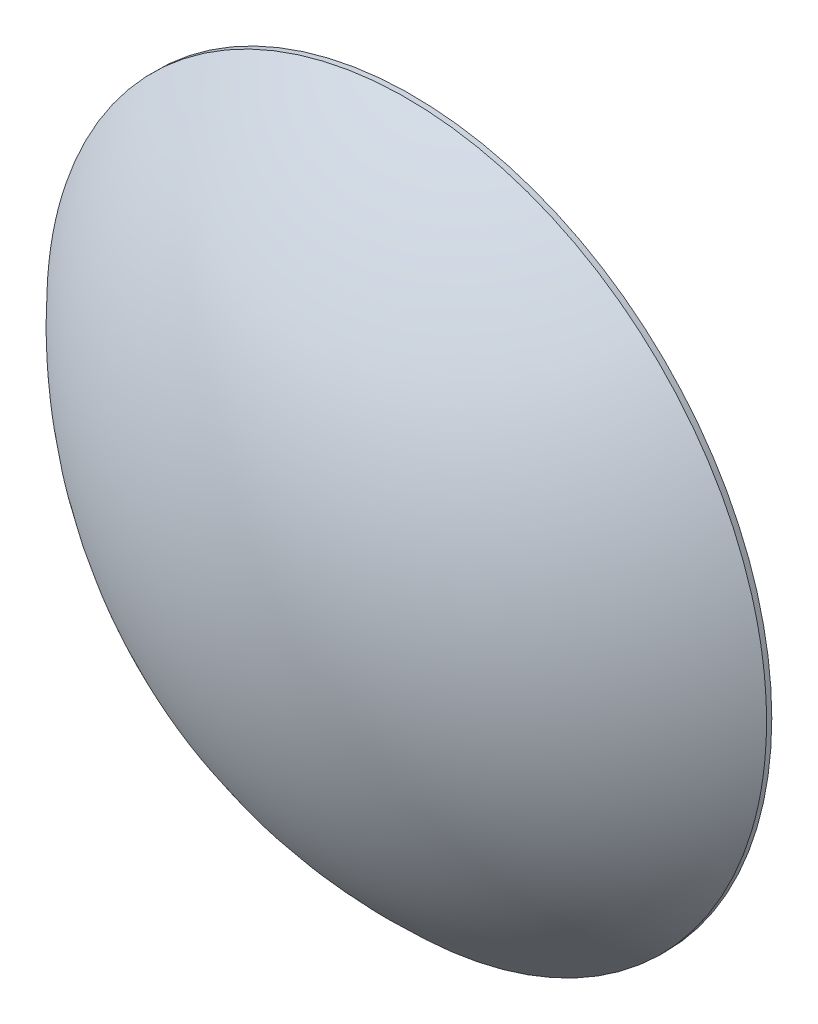
ISO-10303-21;
HEADER;
FILE_DESCRIPTION(('STEP AP214'),'2;1');
FILE_NAME('part.step','',(''),(''),'','','');
FILE_SCHEMA(('AUTOMOTIVE_DESIGN { 1 0 10303 214 1 1 1 1 }'));
ENDSEC;
DATA;
#1=APPLICATION_CONTEXT('core data for automotive mechanical design processes');
#2=APPLICATION_PROTOCOL_DEFINITION('international standard','automotive_design',2000,#1);
#3=PRODUCT_CONTEXT('',#1,'mechanical');
#4=PRODUCT('Part','Part','',(#3));
#5=PRODUCT_RELATED_PRODUCT_CATEGORY('part','',(#4));
#6=PRODUCT_DEFINITION_FORMATION('','',#4);
#7=PRODUCT_DEFINITION_CONTEXT('part definition',#1,'design');
#8=PRODUCT_DEFINITION('design','',#6,#7);
#9=PRODUCT_DEFINITION_SHAPE('','',#8);
#10=(LENGTH_UNIT() NAMED_UNIT(*) SI_UNIT(.MILLI.,.METRE.));
#11=(NAMED_UNIT(*) PLANE_ANGLE_UNIT() SI_UNIT($,.RADIAN.));
#12=(NAMED_UNIT(*) SI_UNIT($,.STERADIAN.) SOLID_ANGLE_UNIT());
#13=UNCERTAINTY_MEASURE_WITH_UNIT(LENGTH_MEASURE(1.E-05),#10,'distance_accuracy_value','');
#14=(GEOMETRIC_REPRESENTATION_CONTEXT(3) GLOBAL_UNCERTAINTY_ASSIGNED_CONTEXT((#13)) GLOBAL_UNIT_ASSIGNED_CONTEXT((#10,
#11,#12)) REPRESENTATION_CONTEXT('',''));
#15=CARTESIAN_POINT('',(0.,0.,0.));
#16=DIRECTION('',(0.,0.,1.));
#17=DIRECTION('',(1.,0.,0.));
#18=AXIS2_PLACEMENT_3D('',#15,#16,#17);
#19=CARTESIAN_POINT('',(6.854801034,4.582996179,-2.111479256));
#20=CARTESIAN_POINT('',(6.854801034,1.962140317,0.821566583));
#21=CARTESIAN_POINT('',(6.854801034,-1.971686381,0.819371852));
#22=CARTESIAN_POINT('',(6.854801034,-4.588885328,-2.118079461));
#23=CARTESIAN_POINT('',(2.933104862,7.844520026,0.802891796));
#24=CARTESIAN_POINT('',(2.933104862,3.358512296,5.823261861));
#25=CARTESIAN_POINT('',(2.933104862,-3.374851886,5.819505234));
#26=CARTESIAN_POINT('',(2.933104862,-7.854600234,0.791594506));
#27=CARTESIAN_POINT('',(-2.937716466,7.840422738,0.79923062));
#28=CARTESIAN_POINT('',(-2.937716466,3.356758105,5.816978484));
#29=CARTESIAN_POINT('',(-2.937716466,-3.37308916,5.81322382));
#30=CARTESIAN_POINT('',(-2.937716466,-7.850497682,0.787939229));
#31=CARTESIAN_POINT('',(-6.85455533,4.583200512,-2.111296671));
#32=CARTESIAN_POINT('',(-6.85455533,1.9622278,0.821879938));
#33=CARTESIAN_POINT('',(-6.85455533,-1.971774288,0.81968511));
#34=CARTESIAN_POINT('',(-6.85455533,-4.589089926,-2.117897171));
#35=(BOUNDED_SURFACE() B_SPLINE_SURFACE(3,3,((#19,#20,#21,#22),(#23,#24,#25,#26),(#27,#28,#29,
#30),(#31,#32,#33,#34)),.UNSPECIFIED.,.F.,.F.,.F.) B_SPLINE_SURFACE_WITH_KNOTS((4,4),(4,4),
(0.00527117099747369,0.999211174130863),(0.,0.999244693938662),
.UNSPECIFIED.) GEOMETRIC_REPRESENTATION_ITEM() RATIONAL_B_SPLINE_SURFACE(((0.996478534598349,
0.774332165362912,0.774164376863725,0.995975169100786),(0.776313805376064,0.603249070648839,
0.603118353805696,0.775921654846634),(0.777311174281622,0.604024094693504,0.60389320991194,
0.776918519936929),(0.999470641315024,0.776657237496909,0.776488945182458,0.99896576437167))) REPRESENTATION_ITEM('') SURFACE());
#36=CARTESIAN_POINT('',(0.,0.,0.));
#37=DIRECTION('',(0.,0.,1.));
#38=DIRECTION('',(1.,0.,0.));
#39=AXIS2_PLACEMENT_3D('',#36,#37,#38);
#40=CIRCLE('',#39,6.8);
#41=CARTESIAN_POINT('',(6.8,0.,0.));
#42=VERTEX_POINT('',#41);
#43=EDGE_CURVE('P0_E18',#42,#42,#40,.T.);
#44=ORIENTED_EDGE('',*,*,#43,.T.);
#45=EDGE_LOOP('',(#44));
#46=FACE_BOUND('',#45,.T.);
#47=ADVANCED_FACE('P0_F14',(#46),#35,.T.);
#48=CARTESIAN_POINT('',(6.8816,-6.8816,-0.1));
#49=DIRECTION('',(0.,0.,-1.));
#50=DIRECTION('',(-1.,0.,0.));
#51=AXIS2_PLACEMENT_3D('',#48,#49,#50);
#52=PLANE('',#51);
#53=CARTESIAN_POINT('',(0.,0.,-0.1));
#54=DIRECTION('',(0.,0.,1.));
#55=DIRECTION('',(1.,0.,0.));
#56=AXIS2_PLACEMENT_3D('',#53,#54,#55);
#57=CIRCLE('',#56,6.8);
#58=CARTESIAN_POINT('',(6.8,0.,-0.1));
#59=VERTEX_POINT('',#58);
#60=EDGE_CURVE('P0_E10',#59,#59,#57,.F.);
#61=ORIENTED_EDGE('',*,*,#60,.T.);
#62=EDGE_LOOP('',(#61));
#63=FACE_BOUND('',#62,.T.);
#64=ADVANCED_FACE('P0_F16',(#63),#52,.T.);
#65=CARTESIAN_POINT('',(0.,0.,-0.1));
#66=DIRECTION('',(0.,0.,1.));
#67=DIRECTION('',(1.,0.,0.));
#68=AXIS2_PLACEMENT_3D('',#65,#66,#67);
#69=CYLINDRICAL_SURFACE('',#68,6.8);
#70=ORIENTED_EDGE('',*,*,#60,.F.);
#71=EDGE_LOOP('',(#70));
#72=FACE_BOUND('',#71,.T.);
#73=ORIENTED_EDGE('',*,*,#43,.F.);
#74=EDGE_LOOP('',(#73));
#75=FACE_BOUND('',#74,.T.);
#76=ADVANCED_FACE('P0_F28',(#72,#75),#69,.T.);
#77=CLOSED_SHELL('',(#47,#64,#76));
#78=MANIFOLD_SOLID_BREP('P0_B1',#77);
#79=CARTESIAN_POINT('',(6.718463385,4.542187349,-2.063942731));
#80=CARTESIAN_POINT('',(6.718463385,1.931990367,0.797943288));
#81=CARTESIAN_POINT('',(6.718463385,-1.941843409,0.795657083));
#82=CARTESIAN_POINT('',(6.718463385,-4.548326634,-2.070684033));
#83=CARTESIAN_POINT('',(2.856577487,7.660472722,0.780104523));
#84=CARTESIAN_POINT('',(2.856577487,3.258333126,5.606721765));
#85=CARTESIAN_POINT('',(2.856577487,-3.274950441,5.602866045));
#86=CARTESIAN_POINT('',(2.856577487,-7.670826727,0.768735208));
#87=CARTESIAN_POINT('',(-2.860617681,7.656787634,0.776743521));
#88=CARTESIAN_POINT('',(-2.860617681,3.256765697,5.601038908));
#89=CARTESIAN_POINT('',(-2.860617681,-3.273375018,5.597185042));
#90=CARTESIAN_POINT('',(-2.860617681,-7.667136658,0.765379674));
#91=CARTESIAN_POINT('',(-6.71804772,4.542522956,-2.063636639));
#92=CARTESIAN_POINT('',(-6.71804772,1.932133115,0.798460834));
#93=CARTESIAN_POINT('',(-6.71804772,-1.941986884,0.796174461));
#94=CARTESIAN_POINT('',(-6.71804772,-4.548662694,-2.070378439));
#95=(BOUNDED_SURFACE() B_SPLINE_SURFACE(3,3,((#79,#80,#81,#82),(#83,#84,#85,#86),(#87,#88,#89,
#90),(#91,#92,#93,#94)),.UNSPECIFIED.,.F.,.F.,.F.) B_SPLINE_SURFACE_WITH_KNOTS((4,4),(4,4),
(0.00518466266431354,0.999231533217942),(0.,0.999265006865177),
.UNSPECIFIED.) GEOMETRIC_REPRESENTATION_ITEM() RATIONAL_B_SPLINE_SURFACE(((0.996614762484301,
0.77945973910677,0.779300131655395,0.996135940130176),(0.781393624122944,0.611133703137532,
0.611008563264473,0.781018204503764),(0.782354041710365,0.611884852799673,0.611759559116125,
0.78197816065972),(0.999496015246564,0.781713188093193,0.781553119210353,0.999015808598044))) REPRESENTATION_ITEM('') SURFACE());
#96=CARTESIAN_POINT('',(6.66398237678822,-0.00235560152903417,0.));
#97=CARTESIAN_POINT('',(6.66391520606561,-0.18945913376971,0.));
#98=CARTESIAN_POINT('',(6.65596358275363,-0.376593797564038,0.));
#99=CARTESIAN_POINT('',(6.62433866270945,-0.749567356459357,0.));
#100=CARTESIAN_POINT('',(6.60066072441409,-0.93540585263296,0.));
#101=CARTESIAN_POINT('',(6.53769766500326,-1.30472931574461,0.));
#102=CARTESIAN_POINT('',(6.49838776934871,-1.48821006715468,0.));
#103=CARTESIAN_POINT('',(6.40440252813921,-1.85135116594692,0.));
#104=CARTESIAN_POINT('',(6.34971471343554,-2.03100828525247,0.));
#105=CARTESIAN_POINT('',(6.22548418456889,-2.38476338518468,0.));
#106=CARTESIAN_POINT('',(6.15596720934815,-2.55887040481043,0.));
#107=CARTESIAN_POINT('',(6.00248185732997,-2.90068845693399,0.));
#108=CARTESIAN_POINT('',(5.91850695037212,-3.06839655725912,0.));
#109=CARTESIAN_POINT('',(5.73672129359473,-3.39614683295685,0.));
#110=CARTESIAN_POINT('',(5.63891002330795,-3.55618871965465,0.));
#111=CARTESIAN_POINT('',(5.43019698949478,-3.86739105089308,0.));
#112=CARTESIAN_POINT('',(5.31930115931552,-4.01855547480219,0.));
#113=CARTESIAN_POINT('',(5.0850959429265,-4.31110163790626,0.));
#114=CARTESIAN_POINT('',(4.96177858179169,-4.4524769927394,0.));
#115=CARTESIAN_POINT('',(4.703792204752,-4.72420040511244,0.));
#116=CARTESIAN_POINT('',(4.56913424818658,-4.85455896320754,0.));
#117=CARTESIAN_POINT('',(4.28925708481339,-5.10353170015036,0.));
#118=CARTESIAN_POINT('',(4.14403312147475,-5.22214053213721,0.));
#119=CARTESIAN_POINT('',(3.84407542527227,-5.44672953493169,0.));
#120=CARTESIAN_POINT('',(3.68933949762851,-5.5527067744358,-2.81071253667126E-13));
#121=CARTESIAN_POINT('',(3.37154243496424,-5.75121347468108,-2.80928036515248E-13));
#122=CARTESIAN_POINT('',(3.20848412931923,-5.843747465138,0.));
#123=CARTESIAN_POINT('',(2.87509152806692,-6.01478422676114,0.));
#124=CARTESIAN_POINT('',(2.70475457349069,-6.09328181503754,0.));
#125=CARTESIAN_POINT('',(2.35813864539703,-6.2356183353895,0.));
#126=CARTESIAN_POINT('',(2.18186196620523,-6.29946285469897,0.));
#127=CARTESIAN_POINT('',(1.82449061629926,-6.41209903404174,0.));
#128=CARTESIAN_POINT('',(1.64339416704814,-6.46088505129895,0.));
#129=CARTESIAN_POINT('',(1.27780940977079,-6.54300807069841,0.));
#130=CARTESIAN_POINT('',(1.09332251648065,-6.57635137101576,0.));
#131=CARTESIAN_POINT('',(0.722111752174043,-6.6273929874659,0.));
#132=CARTESIAN_POINT('',(0.535386905344127,-6.64508420714815,0.));
#133=CARTESIAN_POINT('',(0.161110577184585,-6.66467003237355,0.));
#134=CARTESIAN_POINT('',(-0.0264409041450602,-6.66656463791634,0.));
#135=CARTESIAN_POINT('',(-0.400951575373589,-6.6545465145482,0.));
#136=CARTESIAN_POINT('',(-0.587910995072031,-6.64064094517736,0.));
#137=CARTESIAN_POINT('',(-0.960070474643088,-6.59712397322241,0.));
#138=CARTESIAN_POINT('',(-1.14526978487165,-6.56750615920066,0.));
#139=CARTESIAN_POINT('',(-1.51244549475575,-6.49278542096106,0.));
#140=CARTESIAN_POINT('',(-1.69442307427563,-6.44768829433199,0.));
#141=CARTESIAN_POINT('',(-2.05400204707032,-6.34230684931317,0.));
#142=CARTESIAN_POINT('',(-2.23160174171293,-6.28201673474129,0.));
#143=CARTESIAN_POINT('',(-2.58102516747238,-6.1467116354366,0.));
#144=CARTESIAN_POINT('',(-2.75285100207687,-6.07170208281226,0.));
#145=CARTESIAN_POINT('',(-3.08963121426682,-5.90744931517835,0.));
#146=CARTESIAN_POINT('',(-3.25458325071715,-5.81820129988623,0.));
#147=CARTESIAN_POINT('',(-3.57634384400508,-5.6261467238902,0.));
#148=CARTESIAN_POINT('',(-3.73315427768333,-5.52334330755694,0.));
#149=CARTESIAN_POINT('',(-4.03748904069053,-5.30494229485362,0.));
#150=CARTESIAN_POINT('',(-4.18501754248918,-5.18935051258567,0.));
#151=CARTESIAN_POINT('',(-4.46995566034787,-4.94603825910274,0.));
#152=CARTESIAN_POINT('',(-4.60735537345755,-4.81830619037972,0.));
#153=CARTESIAN_POINT('',(-4.87081557161086,-4.55180278521396,0.));
#154=CARTESIAN_POINT('',(-4.99688332166729,-4.41303863064274,0.));
#155=CARTESIAN_POINT('',(-5.23693778895545,-4.12532023680707,0.));
#156=CARTESIAN_POINT('',(-5.35091902058941,-3.97636142062244,0.));
#157=CARTESIAN_POINT('',(-5.56592035801354,-3.66937494998805,0.));
#158=CARTESIAN_POINT('',(-5.66694095129332,-3.5113476369562,0.));
#159=CARTESIAN_POINT('',(-5.85526486508498,-3.18741641338398,0.));
#160=CARTESIAN_POINT('',(-5.94257437404799,-3.02151610057926,0.));
#161=CARTESIAN_POINT('',(-6.10304916618287,-2.68265958947936,0.));
#162=CARTESIAN_POINT('',(-6.17618979454081,-2.50969171513356,0.));
#163=CARTESIAN_POINT('',(-6.30756414776234,-2.15834365378991,0.));
#164=CARTESIAN_POINT('',(-6.36580993676318,-1.97996797869843,0.));
#165=CARTESIAN_POINT('',(-6.46697682590052,-1.61923341225699,0.));
#166=CARTESIAN_POINT('',(-6.50992212504875,-1.43688129916368,1.19493673665718E-13));
#167=CARTESIAN_POINT('',(-6.58030301488031,-1.06924568665221,-1.19458400870189E-13));
#168=CARTESIAN_POINT('',(-6.60774318006212,-0.883963068425841,-4.45793773946126E-13));
#169=CARTESIAN_POINT('',(-6.63958498896824,-0.58160062203218,-3.0052203580212E-13));
#170=CARTESIAN_POINT('',(-6.6487674206902,-0.465003447511774,0.));
#171=CARTESIAN_POINT('',(-6.66098715995648,-0.231487528038537,0.));
#172=CARTESIAN_POINT('',(-6.6640244675008,-0.114568783085707,0.));
#173=CARTESIAN_POINT('',(-6.66391502100583,0.189465652145831,0.));
#174=CARTESIAN_POINT('',(-6.65596321455669,0.376600309697954,0.));
#175=CARTESIAN_POINT('',(-6.62433792926441,0.749573840359477,0.));
#176=CARTESIAN_POINT('',(-6.60065980893508,0.935412314543696,0.));
#177=CARTESIAN_POINT('',(-6.53769638803874,1.30473571553026,0.));
#178=CARTESIAN_POINT('',(-6.49838631316301,1.48821642681862,0.));
#179=CARTESIAN_POINT('',(-6.40440071745607,1.85135743069713,0.));
#180=CARTESIAN_POINT('',(-6.34971272745833,2.03101449519306,0.));
#181=CARTESIAN_POINT('',(-6.22548185318586,2.38476947240197,0.));
#182=CARTESIAN_POINT('',(-6.15596470773037,2.55887642409914,0.));
#183=CARTESIAN_POINT('',(-6.00247902149035,2.90069432623457,0.));
#184=CARTESIAN_POINT('',(-5.91850395054842,3.06840234449385,0.));
#185=CARTESIAN_POINT('',(-5.73671797332516,3.39615244246708,0.));
#186=CARTESIAN_POINT('',(-5.63890654658202,3.55619423350857,0.));
#187=CARTESIAN_POINT('',(-5.43019320854229,3.86739636063849,0.));
#188=CARTESIAN_POINT('',(-5.3192972305889,4.01856067610118,0.));
#189=CARTESIAN_POINT('',(-5.0850917281533,4.31110661025916,0.));
#190=CARTESIAN_POINT('',(-4.96177422874539,4.45248184457934,0.));
#191=CARTESIAN_POINT('',(-4.70378758592235,4.72420500482598,0.));
#192=CARTESIAN_POINT('',(-4.56912950183567,4.85456343131778,0.));
#193=CARTESIAN_POINT('',(-4.28925209502876,5.10353589459324,0.));
#194=CARTESIAN_POINT('',(-4.1440280157931,5.2221445845229,0.));
#195=CARTESIAN_POINT('',(-3.84407010015499,5.44673329391417,0.));
#196=CARTESIAN_POINT('',(-3.68933406897563,5.55271038207031,-2.75293873882503E-13));
#197=CARTESIAN_POINT('',(-3.37153681234949,5.7512167715214,-2.75171607207619E-13));
#198=CARTESIAN_POINT('',(-3.20847841627132,5.84375060253094,0.));
#199=CARTESIAN_POINT('',(-2.87508564787383,6.01478703815048,0.));
#200=CARTESIAN_POINT('',(-2.70474861659063,6.09328445986809,0.));
#201=CARTESIAN_POINT('',(-2.35813254938608,6.23562064131136,0.));
#202=CARTESIAN_POINT('',(-2.18185580778382,6.29946498827057,0.));
#203=CARTESIAN_POINT('',(-1.82448434777447,6.41210081820322,0.));
#204=CARTESIAN_POINT('',(-1.64338785083595,6.46088665839884,0.));
#205=CARTESIAN_POINT('',(-1.27780301329047,6.54300932036011,0.));
#206=CARTESIAN_POINT('',(-1.09331608741347,6.57635244030239,0.));
#207=CARTESIAN_POINT('',(-0.722105273229563,6.62739369381786,0.));
#208=CARTESIAN_POINT('',(-0.535380409116142,6.64508473093956,0.));
#209=CARTESIAN_POINT('',(-0.161104061842363,6.66467019023837,0.));
#210=CARTESIAN_POINT('',(0.0264474213179771,6.66656461241584,0.));
#211=CARTESIAN_POINT('',(0.400958080753729,6.65454612290119,0.));
#212=CARTESIAN_POINT('',(0.587917486835699,6.64064037074895,0.));
#213=CARTESIAN_POINT('',(0.960076923833988,6.59712303495493,0.));
#214=CARTESIAN_POINT('',(1.14527620509984,6.56750503987504,0.));
#215=CARTESIAN_POINT('',(1.51245184192036,6.49278394267312,0.));
#216=CARTESIAN_POINT('',(1.69442937734502,6.44768663813872,0.));
#217=CARTESIAN_POINT('',(2.05400824713514,6.34230484158111,0.));
#218=CARTESIAN_POINT('',(2.23160788286194,6.28201455337472,0.));
#219=CARTESIAN_POINT('',(2.58103117639341,6.14670911244535,0.));
#220=CARTESIAN_POINT('',(2.75285693769105,6.07169939182878,0.));
#221=CARTESIAN_POINT('',(3.0896369894292,5.90744629488741,0.));
#222=CARTESIAN_POINT('',(3.25458893872664,5.81819811827573,0.));
#223=CARTESIAN_POINT('',(3.57634934444139,5.62614322758837,0.));
#224=CARTESIAN_POINT('',(3.73315967770254,5.52333965788169,0.));
#225=CARTESIAN_POINT('',(4.03749422720767,5.30493834760287,0.));
#226=CARTESIAN_POINT('',(4.18502261593601,5.18934642114125,0.));
#227=CARTESIAN_POINT('',(4.46996049581346,4.94603388916593,0.));
#228=CARTESIAN_POINT('',(4.60736008400021,4.81830168615312,0.));
#229=CARTESIAN_POINT('',(4.8708200215979,4.55179802342465,0.));
#230=CARTESIAN_POINT('',(4.99688763602222,4.41303374556706,0.));
#231=CARTESIAN_POINT('',(5.23694182207781,4.12531511696425,0.));
#232=CARTESIAN_POINT('',(5.3509229081068,3.9763561893042,0.));
#233=CARTESIAN_POINT('',(5.56592394540765,3.66936950844411,0.));
#234=CARTESIAN_POINT('',(5.66694438417427,3.5113420966649,0.));
#235=CARTESIAN_POINT('',(5.85526798124087,3.18741068900989,0.));
#236=CARTESIAN_POINT('',(5.94257732799565,3.02151029086379,0.));
#237=CARTESIAN_POINT('',(6.103051789425,2.68265362164021,0.));
#238=CARTESIAN_POINT('',(6.17619224916597,2.50968567448498,0.));
#239=CARTESIAN_POINT('',(6.30756625973085,2.15833748173991,0.));
#240=CARTESIAN_POINT('',(6.3658118746761,1.97996174803709,0.));
#241=CARTESIAN_POINT('',(6.46697841078505,1.61922708207499,0.));
#242=CARTESIAN_POINT('',(6.50992353118807,1.43687492811032,1.20256237090603E-13));
#243=CARTESIAN_POINT('',(6.5803040607125,1.06923924939207,-1.2022073861135E-13));
#244=CARTESIAN_POINT('',(6.60774404440868,0.883956605840494,-4.48558860008315E-13));
#245=CARTESIAN_POINT('',(6.6395853299867,0.581596290810809,-3.01959426082953E-13));
#246=CARTESIAN_POINT('',(6.64876753402032,0.465001279127313,0.));
#247=CARTESIAN_POINT('',(6.66098704630115,0.231489697279466,0.));
#248=CARTESIAN_POINT('',(6.66402435454835,0.114573127115116,0.));
#249=CARTESIAN_POINT('',(6.66398237678822,-0.00235560152903417,0.));
#250=B_SPLINE_CURVE_WITH_KNOTS('',3,(#96,#97,#98,#99,#100,#101,#102,#103,#104,#105,#106,#107,
#108,#109,#110,#111,#112,#113,#114,#115,#116,#117,#118,#119,#120,#121,#122,#123,#124,#125,#126,
#127,#128,#129,#130,#131,#132,#133,#134,#135,#136,#137,#138,#139,#140,#141,#142,#143,#144,#145,
#146,#147,#148,#149,#150,#151,#152,#153,#154,#155,#156,#157,#158,#159,#160,#161,#162,#163,#164,
#165,#166,#167,#168,#169,#170,#171,#172,#173,#174,#175,#176,#177,#178,#179,#180,#181,#182,#183,
#184,#185,#186,#187,#188,#189,#190,#191,#192,#193,#194,#195,#196,#197,#198,#199,#200,#201,#202,
#203,#204,#205,#206,#207,#208,#209,#210,#211,#212,#213,#214,#215,#216,#217,#218,#219,#220,#221,
#222,#223,#224,#225,#226,#227,#228,#229,#230,#231,#232,#233,#234,#235,#236,#237,#238,#239,#240,
#241,#242,#243,#244,#245,#246,#247,#248,#249),.UNSPECIFIED.,.T.,.F.,(4,2,2,2,2,2,2,2,2,2,2,2,2,
2,2,2,2,2,2,2,2,2,2,2,2,2,2,2,2,2,2,2,2,2,2,2,2,2,2,2,2,2,2,2,2,2,2,2,2,2,2,2,2,2,2,2,2,2,2,2,2,
2,2,2,2,2,2,2,2,2,2,2,2,2,2,2,4),(0.,0.56120356765684,1.12257284610064,1.68483538764168,
2.24755515962133,2.80930605382302,3.37131134079323,3.93333777372198,4.49511032162901,
5.05724586829573,5.61883943161138,6.18068739237573,6.74266548348842,7.30445377415439,
7.86644907663729,8.42822973225701,8.99022064549377,9.55198215344864,10.1139982264649,
10.676014299494,11.2377758074617,11.7997667207413,12.3615473764038,12.9235426788288,
13.4853309694368,14.0473090602787,14.6091570207808,15.1707505843822,15.7328861312994,
16.2946586791366,16.8566851119942,17.4186903991017,17.9804412934466,18.5431610612476,
19.1054235978369,19.6667928794842,20.2279964530795,20.5787222652838,20.9294480774879,
21.4906516510909,22.0520209327457,22.614283469343,23.1770032371521,23.7387541314771,
24.3007594185646,24.8627858514011,25.4245583992172,25.9866939461057,26.5482875096786,
27.1101354701528,27.6721135609665,28.2339018514981,28.7958971538468,29.357677809433,
29.9196687226363,30.4814302305524,31.0434463035298,31.6054623764946,32.1672238843982,
32.729214797657,33.2909954532989,33.8529907558042,34.4147790464926,34.976757137676,
35.5386050985111,36.1001986618977,36.6623342086358,37.2241067566152,37.7861331896163,
38.3481384766581,38.9098893709312,39.4726091429106,40.0348716844513,40.596240962895,
41.1574445305516,41.5081638295987,41.8588831286458),.UNSPECIFIED.);
#251=CARTESIAN_POINT('',(6.66398237678822,-0.00235560152903417,0.));
#252=VERTEX_POINT('',#251);
#253=EDGE_CURVE('P1_E10',#252,#252,#250,.T.);
#254=ORIENTED_EDGE('',*,*,#253,.F.);
#255=EDGE_LOOP('',(#254));
#256=FACE_BOUND('',#255,.T.);
#257=ADVANCED_FACE('P1_F14',(#256),#95,.T.);
#258=CARTESIAN_POINT('',(6.744215397,-6.785988248,0.));
#259=DIRECTION('',(0.,0.,-1.));
#260=DIRECTION('',(-1.,0.,0.));
#261=AXIS2_PLACEMENT_3D('',#258,#259,#260);
#262=PLANE('',#261);
#263=ORIENTED_EDGE('',*,*,#253,.T.);
#264=EDGE_LOOP('',(#263));
#265=FACE_BOUND('',#264,.T.);
#266=ADVANCED_FACE('P1_F16',(#265),#262,.T.);
#267=CLOSED_SHELL('',(#257,#266));
#268=MANIFOLD_SOLID_BREP('P1_B1',#267);
#269=ADVANCED_BREP_SHAPE_REPRESENTATION('',(#18,#78,#268),#14);
#270=SHAPE_DEFINITION_REPRESENTATION(#9,#269);
ENDSEC;
END-ISO-10303-21;
